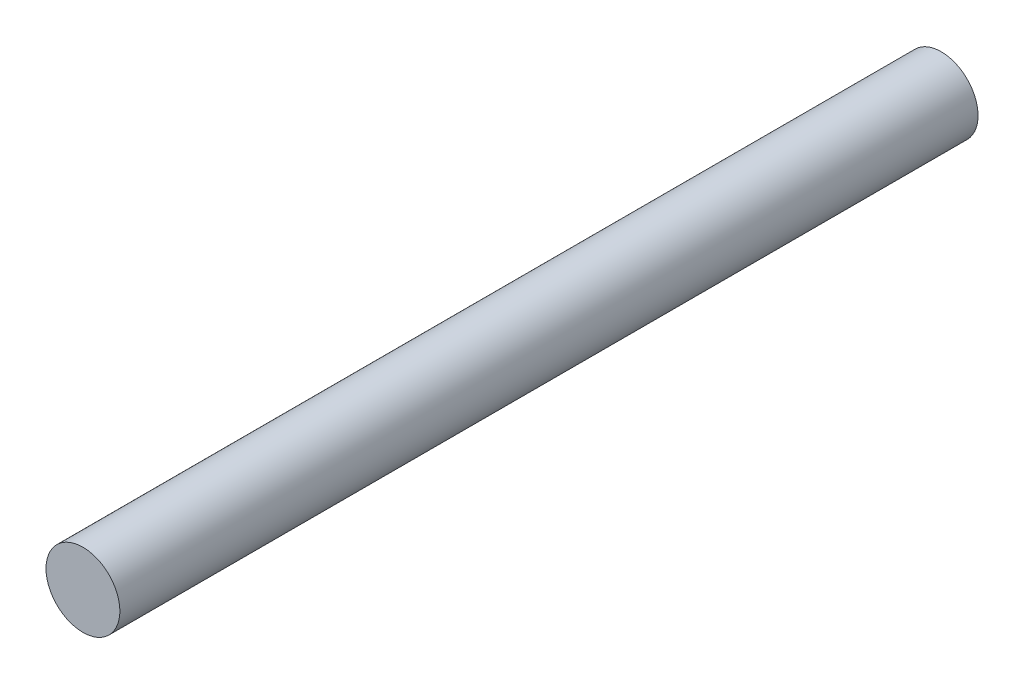
ISO-10303-21;
HEADER;
FILE_DESCRIPTION(('STEP AP214'),'2;1');
FILE_NAME('part.step','',(''),(''),'','','');
FILE_SCHEMA(('AUTOMOTIVE_DESIGN { 1 0 10303 214 1 1 1 1 }'));
ENDSEC;
DATA;
#1=APPLICATION_CONTEXT('core data for automotive mechanical design processes');
#2=APPLICATION_PROTOCOL_DEFINITION('international standard','automotive_design',2000,#1);
#3=PRODUCT_CONTEXT('',#1,'mechanical');
#4=PRODUCT('Part','Part','',(#3));
#5=PRODUCT_RELATED_PRODUCT_CATEGORY('part','',(#4));
#6=PRODUCT_DEFINITION_FORMATION('','',#4);
#7=PRODUCT_DEFINITION_CONTEXT('part definition',#1,'design');
#8=PRODUCT_DEFINITION('design','',#6,#7);
#9=PRODUCT_DEFINITION_SHAPE('','',#8);
#10=(LENGTH_UNIT() NAMED_UNIT(*) SI_UNIT(.MILLI.,.METRE.));
#11=(NAMED_UNIT(*) PLANE_ANGLE_UNIT() SI_UNIT($,.RADIAN.));
#12=(NAMED_UNIT(*) SI_UNIT($,.STERADIAN.) SOLID_ANGLE_UNIT());
#13=UNCERTAINTY_MEASURE_WITH_UNIT(LENGTH_MEASURE(1.E-05),#10,'distance_accuracy_value','');
#14=(GEOMETRIC_REPRESENTATION_CONTEXT(3) GLOBAL_UNCERTAINTY_ASSIGNED_CONTEXT((#13)) GLOBAL_UNIT_ASSIGNED_CONTEXT((#10,
#11,#12)) REPRESENTATION_CONTEXT('',''));
#15=CARTESIAN_POINT('',(0.,0.,0.));
#16=DIRECTION('',(0.,0.,1.));
#17=DIRECTION('',(1.,0.,0.));
#18=AXIS2_PLACEMENT_3D('',#15,#16,#17);
#19=CARTESIAN_POINT('',(0.,0.,93.));
#20=DIRECTION('',(0.,0.,-1.));
#21=DIRECTION('',(-1.,0.,0.));
#22=AXIS2_PLACEMENT_3D('',#19,#20,#21);
#23=CYLINDRICAL_SURFACE('',#22,4.);
#24=CARTESIAN_POINT('',(0.,0.,93.));
#25=DIRECTION('',(0.,0.,1.));
#26=DIRECTION('',(1.,0.,0.));
#27=AXIS2_PLACEMENT_3D('',#24,#25,#26);
#28=CIRCLE('',#27,4.);
#29=CARTESIAN_POINT('',(-4.,0.,93.));
#30=VERTEX_POINT('',#29);
#31=EDGE_CURVE('E10',#30,#30,#28,.T.);
#32=CARTESIAN_POINT('',(0.,0.,0.));
#33=DIRECTION('',(0.,0.,1.));
#34=DIRECTION('',(1.,0.,0.));
#35=AXIS2_PLACEMENT_3D('',#32,#33,#34);
#36=CIRCLE('',#35,4.);
#37=CARTESIAN_POINT('',(-4.,0.,0.));
#38=VERTEX_POINT('',#37);
#39=EDGE_CURVE('E34',#38,#38,#36,.T.);
#40=CARTESIAN_POINT('',(-4.,0.,93.));
#41=CARTESIAN_POINT('',(-4.,0.,92.03125));
#42=CARTESIAN_POINT('',(-4.,0.,91.0625));
#43=CARTESIAN_POINT('',(-4.,0.,89.125));
#44=CARTESIAN_POINT('',(-4.,0.,88.15625));
#45=CARTESIAN_POINT('',(-4.,0.,86.21875));
#46=CARTESIAN_POINT('',(-4.,0.,85.25));
#47=CARTESIAN_POINT('',(-4.,0.,83.3125));
#48=CARTESIAN_POINT('',(-4.,0.,82.34375));
#49=CARTESIAN_POINT('',(-4.,0.,80.40625));
#50=CARTESIAN_POINT('',(-4.,0.,79.4375));
#51=CARTESIAN_POINT('',(-4.,0.,77.5));
#52=CARTESIAN_POINT('',(-4.,0.,76.53125));
#53=CARTESIAN_POINT('',(-4.,0.,74.59375));
#54=CARTESIAN_POINT('',(-4.,0.,73.625));
#55=CARTESIAN_POINT('',(-4.,0.,71.6875));
#56=CARTESIAN_POINT('',(-4.,0.,70.71875));
#57=CARTESIAN_POINT('',(-4.,0.,68.78125));
#58=CARTESIAN_POINT('',(-4.,0.,67.8125));
#59=CARTESIAN_POINT('',(-4.,0.,65.875));
#60=CARTESIAN_POINT('',(-4.,0.,64.90625));
#61=CARTESIAN_POINT('',(-4.,0.,62.96875));
#62=CARTESIAN_POINT('',(-4.,0.,62.));
#63=CARTESIAN_POINT('',(-4.,0.,60.0625));
#64=CARTESIAN_POINT('',(-4.,0.,59.09375));
#65=CARTESIAN_POINT('',(-4.,0.,57.15625));
#66=CARTESIAN_POINT('',(-4.,0.,56.1875));
#67=CARTESIAN_POINT('',(-4.,0.,54.25));
#68=CARTESIAN_POINT('',(-4.,0.,53.28125));
#69=CARTESIAN_POINT('',(-4.,0.,51.34375));
#70=CARTESIAN_POINT('',(-4.,0.,50.375));
#71=CARTESIAN_POINT('',(-4.,0.,48.4375));
#72=CARTESIAN_POINT('',(-4.,0.,47.46875));
#73=CARTESIAN_POINT('',(-4.,0.,45.53125));
#74=CARTESIAN_POINT('',(-4.,0.,44.5625));
#75=CARTESIAN_POINT('',(-4.,0.,42.625));
#76=CARTESIAN_POINT('',(-4.,0.,41.65625));
#77=CARTESIAN_POINT('',(-4.,0.,39.71875));
#78=CARTESIAN_POINT('',(-4.,0.,38.75));
#79=CARTESIAN_POINT('',(-4.,0.,36.8125));
#80=CARTESIAN_POINT('',(-4.,0.,35.84375));
#81=CARTESIAN_POINT('',(-4.,0.,33.90625));
#82=CARTESIAN_POINT('',(-4.,0.,32.9375));
#83=CARTESIAN_POINT('',(-4.,0.,31.));
#84=CARTESIAN_POINT('',(-4.,0.,30.03125));
#85=CARTESIAN_POINT('',(-4.,0.,28.09375));
#86=CARTESIAN_POINT('',(-4.,0.,27.125));
#87=CARTESIAN_POINT('',(-4.,0.,25.1875));
#88=CARTESIAN_POINT('',(-4.,0.,24.21875));
#89=CARTESIAN_POINT('',(-4.,0.,22.28125));
#90=CARTESIAN_POINT('',(-4.,0.,21.3125));
#91=CARTESIAN_POINT('',(-4.,0.,19.375));
#92=CARTESIAN_POINT('',(-4.,0.,18.40625));
#93=CARTESIAN_POINT('',(-4.,0.,16.46875));
#94=CARTESIAN_POINT('',(-4.,0.,15.5));
#95=CARTESIAN_POINT('',(-4.,0.,13.5625));
#96=CARTESIAN_POINT('',(-4.,0.,12.59375));
#97=CARTESIAN_POINT('',(-4.,0.,10.65625));
#98=CARTESIAN_POINT('',(-4.,0.,9.68749999999998));
#99=CARTESIAN_POINT('',(-4.,0.,7.74999999999998));
#100=CARTESIAN_POINT('',(-4.,0.,6.78124999999998));
#101=CARTESIAN_POINT('',(-4.,0.,4.84374999999998));
#102=CARTESIAN_POINT('',(-4.,0.,3.87499999999999));
#103=CARTESIAN_POINT('',(-4.,0.,1.93749999999999));
#104=CARTESIAN_POINT('',(-4.,0.,0.968749999999985));
#105=CARTESIAN_POINT('',(-4.,0.,0.));
#106=B_SPLINE_CURVE_WITH_KNOTS('',3,(#40,#41,#42,#43,#44,#45,#46,#47,#48,#49,#50,#51,#52,#53,
#54,#55,#56,#57,#58,#59,#60,#61,#62,#63,#64,#65,#66,#67,#68,#69,#70,#71,#72,#73,#74,#75,#76,#77,
#78,#79,#80,#81,#82,#83,#84,#85,#86,#87,#88,#89,#90,#91,#92,#93,#94,#95,#96,#97,#98,#99,#100,
#101,#102,#103,#104,#105),.UNSPECIFIED.,.F.,.F.,(4,2,2,2,2,2,2,2,2,2,2,2,2,2,2,2,2,2,2,2,2,2,2,
2,2,2,2,2,2,2,2,2,4),(0.,2.90625000000001,5.81250000000001,8.71875000000001,11.625,14.53125,
17.4375,20.34375,23.25,26.15625,29.0625,31.96875,34.875,37.78125,40.6875,43.59375,46.5,49.40625,
52.3125,55.21875,58.125,61.03125,63.9375,66.84375,69.75,72.65625,75.5625,78.46875,81.375,
84.28125,87.1875,90.09375,93.),.UNSPECIFIED.);
#107=EDGE_CURVE('BSEAM31',#30,#38,#106,.T.);
#108=ORIENTED_EDGE('',*,*,#31,.F.);
#109=ORIENTED_EDGE('',*,*,#39,.T.);
#110=ORIENTED_EDGE('',*,*,#107,.T.);
#111=ORIENTED_EDGE('',*,*,#107,.F.);
#112=EDGE_LOOP('',(#108,#110,#109,#111));
#113=FACE_BOUND('',#112,.T.);
#114=ADVANCED_FACE('F31',(#113),#23,.T.);
#115=CARTESIAN_POINT('',(0.,0.,93.));
#116=DIRECTION('',(0.,0.,1.));
#117=DIRECTION('',(1.,0.,0.));
#118=AXIS2_PLACEMENT_3D('',#115,#116,#117);
#119=PLANE('',#118);
#120=ORIENTED_EDGE('',*,*,#31,.T.);
#121=EDGE_LOOP('',(#120));
#122=FACE_BOUND('',#121,.T.);
#123=ADVANCED_FACE('F46',(#122),#119,.T.);
#124=CARTESIAN_POINT('',(0.,0.,0.));
#125=DIRECTION('',(0.,0.,1.));
#126=DIRECTION('',(1.,0.,0.));
#127=AXIS2_PLACEMENT_3D('',#124,#125,#126);
#128=PLANE('',#127);
#129=ORIENTED_EDGE('',*,*,#39,.F.);
#130=EDGE_LOOP('',(#129));
#131=FACE_BOUND('',#130,.T.);
#132=ADVANCED_FACE('F44',(#131),#128,.F.);
#133=CLOSED_SHELL('',(#114,#123,#132));
#134=MANIFOLD_SOLID_BREP('B2',#133);
#135=ADVANCED_BREP_SHAPE_REPRESENTATION('',(#18,#134),#14);
#136=SHAPE_DEFINITION_REPRESENTATION(#9,#135);
ENDSEC;
END-ISO-10303-21;
